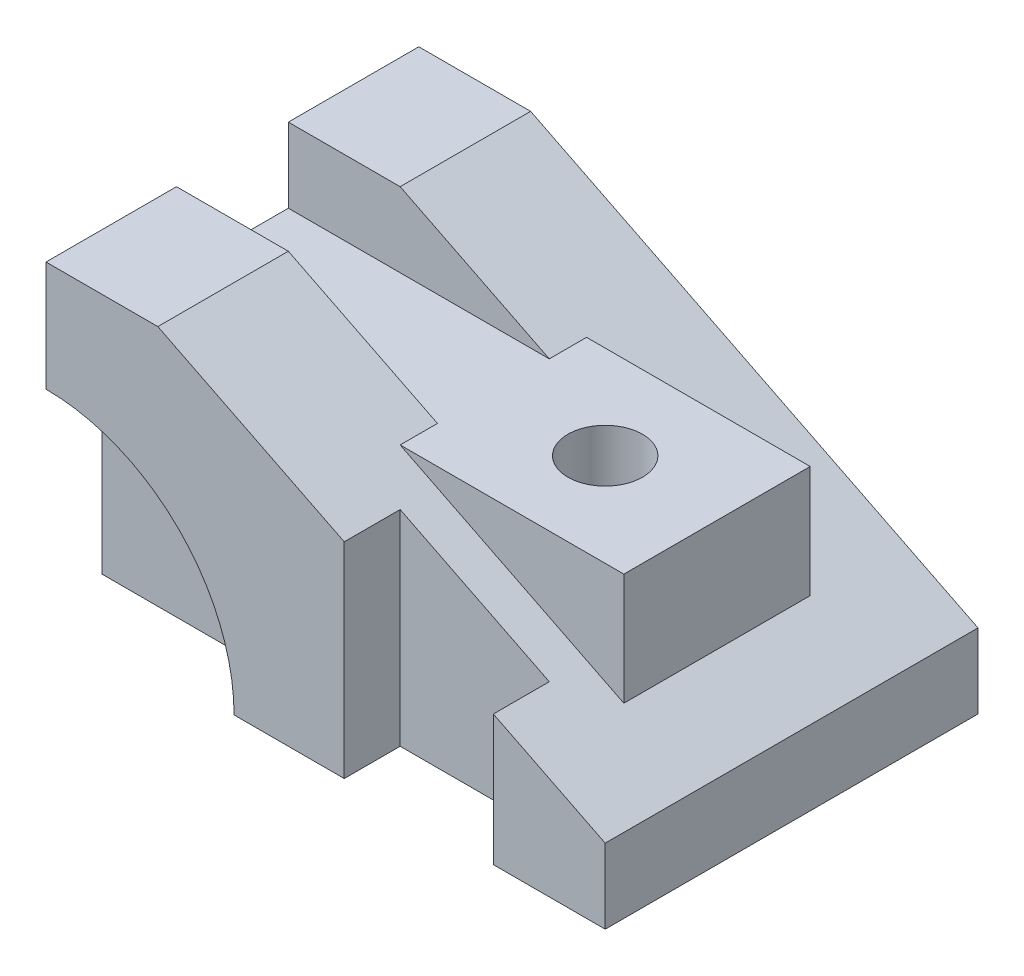
ISO-10303-21;
HEADER;
FILE_DESCRIPTION(('STEP AP214'),'2;1');
FILE_NAME('part.step','',(''),(''),'','','');
FILE_SCHEMA(('AUTOMOTIVE_DESIGN { 1 0 10303 214 1 1 1 1 }'));
ENDSEC;
DATA;
#1=APPLICATION_CONTEXT('core data for automotive mechanical design processes');
#2=APPLICATION_PROTOCOL_DEFINITION('international standard','automotive_design',2000,#1);
#3=PRODUCT_CONTEXT('',#1,'mechanical');
#4=PRODUCT('Part','Part','',(#3));
#5=PRODUCT_RELATED_PRODUCT_CATEGORY('part','',(#4));
#6=PRODUCT_DEFINITION_FORMATION('','',#4);
#7=PRODUCT_DEFINITION_CONTEXT('part definition',#1,'design');
#8=PRODUCT_DEFINITION('design','',#6,#7);
#9=PRODUCT_DEFINITION_SHAPE('','',#8);
#10=(LENGTH_UNIT() NAMED_UNIT(*) SI_UNIT(.MILLI.,.METRE.));
#11=(NAMED_UNIT(*) PLANE_ANGLE_UNIT() SI_UNIT($,.RADIAN.));
#12=(NAMED_UNIT(*) SI_UNIT($,.STERADIAN.) SOLID_ANGLE_UNIT());
#13=UNCERTAINTY_MEASURE_WITH_UNIT(LENGTH_MEASURE(1.E-05),#10,'distance_accuracy_value','');
#14=(GEOMETRIC_REPRESENTATION_CONTEXT(3) GLOBAL_UNCERTAINTY_ASSIGNED_CONTEXT((#13)) GLOBAL_UNIT_ASSIGNED_CONTEXT((#10,
#11,#12)) REPRESENTATION_CONTEXT('',''));
#15=CARTESIAN_POINT('',(0.,0.,0.));
#16=DIRECTION('',(0.,0.,1.));
#17=DIRECTION('',(1.,0.,0.));
#18=AXIS2_PLACEMENT_3D('',#15,#16,#17);
#19=CARTESIAN_POINT('',(0.,0.,50.));
#20=DIRECTION('',(0.,0.,-1.));
#21=DIRECTION('',(-1.,0.,0.));
#22=AXIS2_PLACEMENT_3D('',#19,#20,#21);
#23=PLANE('',#22);
#24=DIRECTION('',(1.,0.,0.));
#25=VECTOR('',#24,1.);
#26=CARTESIAN_POINT('',(150.,0.,50.));
#27=LINE('',#26,#25);
#28=CARTESIAN_POINT('',(50.4505313599585,0.,50.));
#29=VERTEX_POINT('',#28);
#30=CARTESIAN_POINT('',(80.,0.,50.));
#31=VERTEX_POINT('',#30);
#32=EDGE_CURVE('E336',#29,#31,#27,.T.);
#33=ORIENTED_EDGE('',*,*,#32,.T.);
#34=DIRECTION('',(0.,-1.,0.));
#35=VECTOR('',#34,1.);
#36=CARTESIAN_POINT('',(80.,80.001,50.));
#37=LINE('',#36,#35);
#38=CARTESIAN_POINT('',(80.,55.,50.));
#39=VERTEX_POINT('',#38);
#40=EDGE_CURVE('E190',#39,#31,#37,.T.);
#41=ORIENTED_EDGE('',*,*,#40,.F.);
#42=DIRECTION('',(-0.894427190999916,0.447213595499958,0.));
#43=VECTOR('',#42,1.);
#44=CARTESIAN_POINT('',(30.,80.,50.));
#45=LINE('',#44,#43);
#46=CARTESIAN_POINT('',(30.,80.,50.));
#47=VERTEX_POINT('',#46);
#48=EDGE_CURVE('E195',#39,#47,#45,.T.);
#49=ORIENTED_EDGE('',*,*,#48,.T.);
#50=DIRECTION('',(-1.,0.,0.));
#51=VECTOR('',#50,1.);
#52=CARTESIAN_POINT('',(0.,80.,50.));
#53=LINE('',#52,#51);
#54=CARTESIAN_POINT('',(0.,80.,50.));
#55=VERTEX_POINT('',#54);
#56=EDGE_CURVE('E347',#47,#55,#53,.T.);
#57=ORIENTED_EDGE('',*,*,#56,.T.);
#58=DIRECTION('',(0.,-1.,0.));
#59=VECTOR('',#58,1.);
#60=CARTESIAN_POINT('',(0.,0.,50.));
#61=LINE('',#60,#59);
#62=CARTESIAN_POINT('',(0.,50.4505313599585,50.));
#63=VERTEX_POINT('',#62);
#64=EDGE_CURVE('E350',#55,#63,#61,.T.);
#65=ORIENTED_EDGE('',*,*,#64,.T.);
#66=CARTESIAN_POINT('',(0.,0.,50.));
#67=DIRECTION('',(0.,0.,-1.));
#68=DIRECTION('',(-1.,0.,0.));
#69=AXIS2_PLACEMENT_3D('',#66,#67,#68);
#70=CIRCLE('',#69,50.4505313599585);
#71=EDGE_CURVE('E298',#29,#63,#70,.F.);
#72=ORIENTED_EDGE('',*,*,#71,.F.);
#73=EDGE_LOOP('',(#33,#41,#49,#57,#65,#72));
#74=FACE_BOUND('',#73,.T.);
#75=ADVANCED_FACE('F47',(#74),#23,.F.);
#76=CARTESIAN_POINT('',(0.,0.,50.));
#77=DIRECTION('',(1.,0.,0.));
#78=DIRECTION('',(0.,0.,-1.));
#79=AXIS2_PLACEMENT_3D('',#76,#77,#78);
#80=PLANE('',#79);
#81=DIRECTION('',(0.,-1.,0.));
#82=VECTOR('',#81,1.);
#83=CARTESIAN_POINT('',(0.,80.,15.));
#84=LINE('',#83,#82);
#85=CARTESIAN_POINT('',(0.,80.,15.));
#86=VERTEX_POINT('',#85);
#87=CARTESIAN_POINT('',(0.,60.,15.));
#88=VERTEX_POINT('',#87);
#89=EDGE_CURVE('E224',#86,#88,#84,.T.);
#90=ORIENTED_EDGE('',*,*,#89,.T.);
#91=DIRECTION('',(0.,0.,-1.));
#92=VECTOR('',#91,1.);
#93=CARTESIAN_POINT('',(0.,60.,15.));
#94=LINE('',#93,#92);
#95=CARTESIAN_POINT('',(0.,60.,-15.));
#96=VERTEX_POINT('',#95);
#97=EDGE_CURVE('E228',#88,#96,#94,.T.);
#98=ORIENTED_EDGE('',*,*,#97,.T.);
#99=DIRECTION('',(0.,1.,0.));
#100=VECTOR('',#99,1.);
#101=CARTESIAN_POINT('',(0.,80.,-15.));
#102=LINE('',#101,#100);
#103=CARTESIAN_POINT('',(0.,80.,-15.));
#104=VERTEX_POINT('',#103);
#105=EDGE_CURVE('E232',#96,#104,#102,.T.);
#106=ORIENTED_EDGE('',*,*,#105,.T.);
#107=DIRECTION('',(0.,0.,-1.));
#108=VECTOR('',#107,1.);
#109=CARTESIAN_POINT('',(0.,80.,50.));
#110=LINE('',#109,#108);
#111=CARTESIAN_POINT('',(0.,80.,-50.));
#112=VERTEX_POINT('',#111);
#113=EDGE_CURVE('E356',#104,#112,#110,.T.);
#114=ORIENTED_EDGE('',*,*,#113,.T.);
#115=DIRECTION('',(0.,-1.,0.));
#116=VECTOR('',#115,1.);
#117=CARTESIAN_POINT('',(0.,0.,-50.));
#118=LINE('',#117,#116);
#119=CARTESIAN_POINT('',(0.,0.,-50.));
#120=VERTEX_POINT('',#119);
#121=EDGE_CURVE('E331',#112,#120,#118,.T.);
#122=ORIENTED_EDGE('',*,*,#121,.T.);
#123=DIRECTION('',(0.,0.,-1.));
#124=VECTOR('',#123,1.);
#125=CARTESIAN_POINT('',(0.,0.,50.));
#126=LINE('',#125,#124);
#127=CARTESIAN_POINT('',(0.,0.,35.));
#128=VERTEX_POINT('',#127);
#129=EDGE_CURVE('E353',#128,#120,#126,.T.);
#130=ORIENTED_EDGE('',*,*,#129,.F.);
#131=DIRECTION('',(0.,-1.,0.));
#132=VECTOR('',#131,1.);
#133=CARTESIAN_POINT('',(0.,0.,35.));
#134=LINE('',#133,#132);
#135=CARTESIAN_POINT('',(0.,50.4505313599585,35.));
#136=VERTEX_POINT('',#135);
#137=EDGE_CURVE('E302',#136,#128,#134,.T.);
#138=ORIENTED_EDGE('',*,*,#137,.F.);
#139=DIRECTION('',(0.,0.,-1.));
#140=VECTOR('',#139,1.);
#141=CARTESIAN_POINT('',(0.,50.4505313599585,421.53853654145));
#142=LINE('',#141,#140);
#143=EDGE_CURVE('E305',#63,#136,#142,.T.);
#144=ORIENTED_EDGE('',*,*,#143,.F.);
#145=ORIENTED_EDGE('',*,*,#64,.F.);
#146=EDGE_CURVE('E357',#55,#86,#110,.T.);
#147=ORIENTED_EDGE('',*,*,#146,.T.);
#148=EDGE_LOOP('',(#90,#98,#106,#114,#122,#130,#138,#144,#145,#147));
#149=FACE_BOUND('',#148,.T.);
#150=ADVANCED_FACE('F385',(#149),#80,.F.);
#151=CARTESIAN_POINT('',(30.,80.,50.));
#152=DIRECTION('',(-0.447213595499958,-0.894427190999916,0.));
#153=DIRECTION('',(0.894427190999916,-0.447213595499958,0.));
#154=AXIS2_PLACEMENT_3D('',#151,#152,#153);
#155=PLANE('',#154);
#156=ORIENTED_EDGE('',*,*,#48,.F.);
#157=DIRECTION('',(0.,0.,1.));
#158=VECTOR('',#157,1.);
#159=CARTESIAN_POINT('',(80.,55.,50.));
#160=LINE('',#159,#158);
#161=CARTESIAN_POINT('',(80.,55.,35.));
#162=VERTEX_POINT('',#161);
#163=EDGE_CURVE('E173',#162,#39,#160,.T.);
#164=ORIENTED_EDGE('',*,*,#163,.F.);
#165=DIRECTION('',(-0.894427190999916,0.447213595499958,0.));
#166=VECTOR('',#165,1.);
#167=CARTESIAN_POINT('',(69.9996,60.0002,35.));
#168=LINE('',#167,#166);
#169=CARTESIAN_POINT('',(120.,35.,35.));
#170=VERTEX_POINT('',#169);
#171=EDGE_CURVE('E183',#170,#162,#168,.T.);
#172=ORIENTED_EDGE('',*,*,#171,.F.);
#173=DIRECTION('',(0.,0.,-1.));
#174=VECTOR('',#173,1.);
#175=CARTESIAN_POINT('',(120.,35.,50.));
#176=LINE('',#175,#174);
#177=CARTESIAN_POINT('',(120.,35.,50.));
#178=VERTEX_POINT('',#177);
#179=EDGE_CURVE('E197',#178,#170,#176,.T.);
#180=ORIENTED_EDGE('',*,*,#179,.F.);
#181=CARTESIAN_POINT('',(150.,20.,50.));
#182=VERTEX_POINT('',#181);
#183=EDGE_CURVE('E343',#182,#178,#45,.T.);
#184=ORIENTED_EDGE('',*,*,#183,.F.);
#185=DIRECTION('',(0.,0.,-1.));
#186=VECTOR('',#185,1.);
#187=CARTESIAN_POINT('',(150.,20.,50.));
#188=LINE('',#187,#186);
#189=CARTESIAN_POINT('',(150.,20.,-50.));
#190=VERTEX_POINT('',#189);
#191=EDGE_CURVE('E56',#182,#190,#188,.T.);
#192=ORIENTED_EDGE('',*,*,#191,.T.);
#193=DIRECTION('',(-0.894427190999916,0.447213595499958,0.));
#194=VECTOR('',#193,1.);
#195=CARTESIAN_POINT('',(30.,80.,-50.));
#196=LINE('',#195,#194);
#197=CARTESIAN_POINT('',(30.,80.,-50.));
#198=VERTEX_POINT('',#197);
#199=EDGE_CURVE('E323',#190,#198,#196,.T.);
#200=ORIENTED_EDGE('',*,*,#199,.T.);
#201=DIRECTION('',(0.,0.,-1.));
#202=VECTOR('',#201,1.);
#203=CARTESIAN_POINT('',(30.,80.,50.));
#204=LINE('',#203,#202);
#205=CARTESIAN_POINT('',(30.,80.,-15.));
#206=VERTEX_POINT('',#205);
#207=EDGE_CURVE('E361',#206,#198,#204,.T.);
#208=ORIENTED_EDGE('',*,*,#207,.F.);
#209=DIRECTION('',(0.894427190999916,-0.447213595499958,0.));
#210=VECTOR('',#209,1.);
#211=CARTESIAN_POINT('',(126.0008,31.9996,-15.));
#212=LINE('',#211,#210);
#213=CARTESIAN_POINT('',(70.,60.,-15.));
#214=VERTEX_POINT('',#213);
#215=EDGE_CURVE('E189',#206,#214,#212,.T.);
#216=ORIENTED_EDGE('',*,*,#215,.T.);
#217=DIRECTION('',(0.,0.,1.));
#218=VECTOR('',#217,1.);
#219=CARTESIAN_POINT('',(70.,60.,-25.));
#220=LINE('',#219,#218);
#221=CARTESIAN_POINT('',(70.,60.,-25.));
#222=VERTEX_POINT('',#221);
#223=EDGE_CURVE('E281',#222,#214,#220,.T.);
#224=ORIENTED_EDGE('',*,*,#223,.F.);
#225=DIRECTION('',(0.894427190999916,-0.447213595499958,0.));
#226=VECTOR('',#225,1.);
#227=CARTESIAN_POINT('',(130.,30.,-25.));
#228=LINE('',#227,#226);
#229=CARTESIAN_POINT('',(130.,30.,-25.));
#230=VERTEX_POINT('',#229);
#231=EDGE_CURVE('E268',#222,#230,#228,.T.);
#232=ORIENTED_EDGE('',*,*,#231,.T.);
#233=DIRECTION('',(0.,0.,1.));
#234=VECTOR('',#233,1.);
#235=CARTESIAN_POINT('',(130.,30.,-25.));
#236=LINE('',#235,#234);
#237=CARTESIAN_POINT('',(130.,30.,25.));
#238=VERTEX_POINT('',#237);
#239=EDGE_CURVE('E280',#230,#238,#236,.T.);
#240=ORIENTED_EDGE('',*,*,#239,.T.);
#241=DIRECTION('',(0.894427190999916,-0.447213595499958,0.));
#242=VECTOR('',#241,1.);
#243=CARTESIAN_POINT('',(130.,30.,25.));
#244=LINE('',#243,#242);
#245=CARTESIAN_POINT('',(70.,60.,25.));
#246=VERTEX_POINT('',#245);
#247=EDGE_CURVE('E253',#246,#238,#244,.T.);
#248=ORIENTED_EDGE('',*,*,#247,.F.);
#249=CARTESIAN_POINT('',(70.,60.,15.));
#250=VERTEX_POINT('',#249);
#251=EDGE_CURVE('E286',#250,#246,#220,.T.);
#252=ORIENTED_EDGE('',*,*,#251,.F.);
#253=DIRECTION('',(-0.894427190999916,0.447213595499958,0.));
#254=VECTOR('',#253,1.);
#255=CARTESIAN_POINT('',(126.0008,31.9996,15.));
#256=LINE('',#255,#254);
#257=CARTESIAN_POINT('',(30.,80.,15.));
#258=VERTEX_POINT('',#257);
#259=EDGE_CURVE('E220',#250,#258,#256,.T.);
#260=ORIENTED_EDGE('',*,*,#259,.T.);
#261=EDGE_CURVE('E362',#47,#258,#204,.T.);
#262=ORIENTED_EDGE('',*,*,#261,.F.);
#263=EDGE_LOOP('',(#156,#164,#172,#180,#184,#192,#200,#208,#216,#224,#232,#240,#248,#252,#260,#262));
#264=FACE_BOUND('',#263,.T.);
#265=ADVANCED_FACE('F193',(#264),#155,.F.);
#266=CARTESIAN_POINT('',(0.,80.,50.));
#267=DIRECTION('',(0.,-1.,0.));
#268=DIRECTION('',(0.,0.,-1.));
#269=AXIS2_PLACEMENT_3D('',#266,#267,#268);
#270=PLANE('',#269);
#271=DIRECTION('',(-1.,0.,0.));
#272=VECTOR('',#271,1.);
#273=CARTESIAN_POINT('',(150.001,80.,15.));
#274=LINE('',#273,#272);
#275=EDGE_CURVE('E236',#258,#86,#274,.T.);
#276=ORIENTED_EDGE('',*,*,#275,.T.);
#277=ORIENTED_EDGE('',*,*,#146,.F.);
#278=ORIENTED_EDGE('',*,*,#56,.F.);
#279=ORIENTED_EDGE('',*,*,#261,.T.);
#280=EDGE_LOOP('',(#276,#277,#278,#279));
#281=FACE_BOUND('',#280,.T.);
#282=ADVANCED_FACE('F415',(#281),#270,.F.);
#283=DIRECTION('',(-1.,0.,0.));
#284=VECTOR('',#283,1.);
#285=CARTESIAN_POINT('',(150.001,80.,-15.));
#286=LINE('',#285,#284);
#287=EDGE_CURVE('E240',#206,#104,#286,.T.);
#288=ORIENTED_EDGE('',*,*,#287,.F.);
#289=ORIENTED_EDGE('',*,*,#207,.T.);
#290=DIRECTION('',(-1.,0.,0.));
#291=VECTOR('',#290,1.);
#292=CARTESIAN_POINT('',(0.,80.,-50.));
#293=LINE('',#292,#291);
#294=EDGE_CURVE('E327',#198,#112,#293,.T.);
#295=ORIENTED_EDGE('',*,*,#294,.T.);
#296=ORIENTED_EDGE('',*,*,#113,.F.);
#297=EDGE_LOOP('',(#288,#289,#295,#296));
#298=FACE_BOUND('',#297,.T.);
#299=ADVANCED_FACE('F391',(#298),#270,.F.);
#300=ORIENTED_EDGE('',*,*,#183,.T.);
#301=DIRECTION('',(0.,-1.,0.));
#302=VECTOR('',#301,1.);
#303=CARTESIAN_POINT('',(120.,80.001,50.));
#304=LINE('',#303,#302);
#305=CARTESIAN_POINT('',(120.,0.,50.));
#306=VERTEX_POINT('',#305);
#307=EDGE_CURVE('E211',#178,#306,#304,.T.);
#308=ORIENTED_EDGE('',*,*,#307,.T.);
#309=CARTESIAN_POINT('',(150.,0.,50.));
#310=VERTEX_POINT('',#309);
#311=EDGE_CURVE('E335',#306,#310,#27,.T.);
#312=ORIENTED_EDGE('',*,*,#311,.T.);
#313=DIRECTION('',(0.,1.,0.));
#314=VECTOR('',#313,1.);
#315=CARTESIAN_POINT('',(150.,20.,50.));
#316=LINE('',#315,#314);
#317=EDGE_CURVE('E340',#310,#182,#316,.T.);
#318=ORIENTED_EDGE('',*,*,#317,.T.);
#319=EDGE_LOOP('',(#300,#308,#312,#318));
#320=FACE_BOUND('',#319,.T.);
#321=ADVANCED_FACE('F424',(#320),#23,.F.);
#322=CARTESIAN_POINT('',(150.,0.,50.));
#323=DIRECTION('',(0.,1.,0.));
#324=DIRECTION('',(-1.,0.,0.));
#325=AXIS2_PLACEMENT_3D('',#322,#323,#324);
#326=PLANE('',#325);
#327=CARTESIAN_POINT('',(100.,0.,0.));
#328=DIRECTION('',(0.,1.,0.));
#329=DIRECTION('',(0.,0.,1.));
#330=AXIS2_PLACEMENT_3D('',#327,#328,#329);
#331=CIRCLE('',#330,9.99999999999999);
#332=CARTESIAN_POINT('',(100.,0.,9.99999999999999));
#333=VERTEX_POINT('',#332);
#334=EDGE_CURVE('E249',#333,#333,#331,.T.);
#335=ORIENTED_EDGE('',*,*,#334,.T.);
#336=EDGE_LOOP('',(#335));
#337=FACE_BOUND('',#336,.T.);
#338=DIRECTION('',(1.,0.,0.));
#339=VECTOR('',#338,1.);
#340=CARTESIAN_POINT('',(80.,0.,35.));
#341=LINE('',#340,#339);
#342=CARTESIAN_POINT('',(80.,0.,35.));
#343=VERTEX_POINT('',#342);
#344=CARTESIAN_POINT('',(120.,0.,35.));
#345=VERTEX_POINT('',#344);
#346=EDGE_CURVE('E201',#343,#345,#341,.T.);
#347=ORIENTED_EDGE('',*,*,#346,.F.);
#348=DIRECTION('',(0.,0.,-1.));
#349=VECTOR('',#348,1.);
#350=CARTESIAN_POINT('',(80.,0.,50.));
#351=LINE('',#350,#349);
#352=EDGE_CURVE('E63',#31,#343,#351,.T.);
#353=ORIENTED_EDGE('',*,*,#352,.F.);
#354=ORIENTED_EDGE('',*,*,#32,.F.);
#355=DIRECTION('',(0.,0.,-1.));
#356=VECTOR('',#355,1.);
#357=CARTESIAN_POINT('',(50.4505313599585,0.,421.53853654145));
#358=LINE('',#357,#356);
#359=CARTESIAN_POINT('',(50.4505313599585,0.,35.));
#360=VERTEX_POINT('',#359);
#361=EDGE_CURVE('E297',#29,#360,#358,.T.);
#362=ORIENTED_EDGE('',*,*,#361,.T.);
#363=DIRECTION('',(1.,0.,0.));
#364=VECTOR('',#363,1.);
#365=CARTESIAN_POINT('',(150.,0.,35.));
#366=LINE('',#365,#364);
#367=EDGE_CURVE('E285',#128,#360,#366,.T.);
#368=ORIENTED_EDGE('',*,*,#367,.F.);
#369=ORIENTED_EDGE('',*,*,#129,.T.);
#370=DIRECTION('',(1.,0.,0.));
#371=VECTOR('',#370,1.);
#372=CARTESIAN_POINT('',(150.,0.,-50.));
#373=LINE('',#372,#371);
#374=CARTESIAN_POINT('',(150.,0.,-50.));
#375=VERTEX_POINT('',#374);
#376=EDGE_CURVE('E309',#120,#375,#373,.T.);
#377=ORIENTED_EDGE('',*,*,#376,.T.);
#378=DIRECTION('',(0.,0.,-1.));
#379=VECTOR('',#378,1.);
#380=CARTESIAN_POINT('',(150.,0.,50.));
#381=LINE('',#380,#379);
#382=EDGE_CURVE('E11',#310,#375,#381,.T.);
#383=ORIENTED_EDGE('',*,*,#382,.F.);
#384=ORIENTED_EDGE('',*,*,#311,.F.);
#385=DIRECTION('',(0.,0.,1.));
#386=VECTOR('',#385,1.);
#387=CARTESIAN_POINT('',(120.,0.,50.));
#388=LINE('',#387,#386);
#389=EDGE_CURVE('E180',#345,#306,#388,.T.);
#390=ORIENTED_EDGE('',*,*,#389,.F.);
#391=EDGE_LOOP('',(#347,#353,#354,#362,#368,#369,#377,#383,#384,#390));
#392=FACE_BOUND('',#391,.T.);
#393=ADVANCED_FACE('F49',(#337,#392),#326,.F.);
#394=CARTESIAN_POINT('',(150.,20.,50.));
#395=DIRECTION('',(-1.,0.,0.));
#396=DIRECTION('',(0.,0.,1.));
#397=AXIS2_PLACEMENT_3D('',#394,#395,#396);
#398=PLANE('',#397);
#399=ORIENTED_EDGE('',*,*,#382,.T.);
#400=DIRECTION('',(0.,1.,0.));
#401=VECTOR('',#400,1.);
#402=CARTESIAN_POINT('',(150.,20.,-50.));
#403=LINE('',#402,#401);
#404=EDGE_CURVE('E319',#375,#190,#403,.T.);
#405=ORIENTED_EDGE('',*,*,#404,.T.);
#406=ORIENTED_EDGE('',*,*,#191,.F.);
#407=ORIENTED_EDGE('',*,*,#317,.F.);
#408=EDGE_LOOP('',(#399,#405,#406,#407));
#409=FACE_BOUND('',#408,.T.);
#410=ADVANCED_FACE('F378',(#409),#398,.F.);
#411=CARTESIAN_POINT('',(0.,0.,-50.));
#412=DIRECTION('',(0.,0.,-1.));
#413=DIRECTION('',(-1.,0.,0.));
#414=AXIS2_PLACEMENT_3D('',#411,#412,#413);
#415=PLANE('',#414);
#416=ORIENTED_EDGE('',*,*,#376,.F.);
#417=ORIENTED_EDGE('',*,*,#121,.F.);
#418=ORIENTED_EDGE('',*,*,#294,.F.);
#419=ORIENTED_EDGE('',*,*,#199,.F.);
#420=ORIENTED_EDGE('',*,*,#404,.F.);
#421=EDGE_LOOP('',(#416,#417,#418,#419,#420));
#422=FACE_BOUND('',#421,.T.);
#423=ADVANCED_FACE('F376',(#422),#415,.T.);
#424=CARTESIAN_POINT('',(0.,0.,421.53853654145));
#425=DIRECTION('',(0.,0.,-1.));
#426=DIRECTION('',(-1.,0.,0.));
#427=AXIS2_PLACEMENT_3D('',#424,#425,#426);
#428=CYLINDRICAL_SURFACE('',#427,50.4505313599585);
#429=ORIENTED_EDGE('',*,*,#71,.T.);
#430=ORIENTED_EDGE('',*,*,#143,.T.);
#431=CARTESIAN_POINT('',(0.,0.,35.));
#432=DIRECTION('',(0.,0.,-1.));
#433=DIRECTION('',(-1.,0.,0.));
#434=AXIS2_PLACEMENT_3D('',#431,#432,#433);
#435=CIRCLE('',#434,50.4505313599585);
#436=EDGE_CURVE('E293',#360,#136,#435,.F.);
#437=ORIENTED_EDGE('',*,*,#436,.F.);
#438=ORIENTED_EDGE('',*,*,#361,.F.);
#439=EDGE_LOOP('',(#429,#430,#437,#438));
#440=FACE_BOUND('',#439,.T.);
#441=ADVANCED_FACE('F450',(#440),#428,.F.);
#442=CARTESIAN_POINT('',(0.,0.,35.));
#443=DIRECTION('',(0.,0.,-1.));
#444=DIRECTION('',(-1.,0.,0.));
#445=AXIS2_PLACEMENT_3D('',#442,#443,#444);
#446=PLANE('',#445);
#447=ORIENTED_EDGE('',*,*,#436,.T.);
#448=ORIENTED_EDGE('',*,*,#137,.T.);
#449=ORIENTED_EDGE('',*,*,#367,.T.);
#450=EDGE_LOOP('',(#447,#448,#449));
#451=FACE_BOUND('',#450,.T.);
#452=ADVANCED_FACE('F454',(#451),#446,.F.);
#453=CARTESIAN_POINT('',(70.,60.,-25.));
#454=DIRECTION('',(0.,1.,0.));
#455=DIRECTION('',(0.,0.,1.));
#456=AXIS2_PLACEMENT_3D('',#453,#454,#455);
#457=PLANE('',#456);
#458=CARTESIAN_POINT('',(100.,60.,0.));
#459=DIRECTION('',(0.,1.,0.));
#460=DIRECTION('',(0.,0.,1.));
#461=AXIS2_PLACEMENT_3D('',#458,#459,#460);
#462=CIRCLE('',#461,9.99999999999999);
#463=CARTESIAN_POINT('',(100.,60.,9.99999999999999));
#464=VERTEX_POINT('',#463);
#465=EDGE_CURVE('E248',#464,#464,#462,.T.);
#466=ORIENTED_EDGE('',*,*,#465,.F.);
#467=EDGE_LOOP('',(#466));
#468=FACE_BOUND('',#467,.T.);
#469=ORIENTED_EDGE('',*,*,#223,.T.);
#470=DIRECTION('',(-1.,0.,0.));
#471=VECTOR('',#470,1.);
#472=CARTESIAN_POINT('',(150.001,60.,-15.));
#473=LINE('',#472,#471);
#474=EDGE_CURVE('E243',#214,#96,#473,.T.);
#475=ORIENTED_EDGE('',*,*,#474,.T.);
#476=ORIENTED_EDGE('',*,*,#97,.F.);
#477=DIRECTION('',(-1.,0.,0.));
#478=VECTOR('',#477,1.);
#479=CARTESIAN_POINT('',(150.001,60.,15.));
#480=LINE('',#479,#478);
#481=EDGE_CURVE('E71',#250,#88,#480,.T.);
#482=ORIENTED_EDGE('',*,*,#481,.F.);
#483=ORIENTED_EDGE('',*,*,#251,.T.);
#484=DIRECTION('',(-1.,0.,0.));
#485=VECTOR('',#484,1.);
#486=CARTESIAN_POINT('',(70.,60.,25.));
#487=LINE('',#486,#485);
#488=CARTESIAN_POINT('',(130.,60.,25.));
#489=VERTEX_POINT('',#488);
#490=EDGE_CURVE('E264',#489,#246,#487,.T.);
#491=ORIENTED_EDGE('',*,*,#490,.F.);
#492=DIRECTION('',(0.,0.,1.));
#493=VECTOR('',#492,1.);
#494=CARTESIAN_POINT('',(130.,60.,-25.));
#495=LINE('',#494,#493);
#496=CARTESIAN_POINT('',(130.,60.,-25.));
#497=VERTEX_POINT('',#496);
#498=EDGE_CURVE('E287',#497,#489,#495,.T.);
#499=ORIENTED_EDGE('',*,*,#498,.F.);
#500=DIRECTION('',(-1.,0.,0.));
#501=VECTOR('',#500,1.);
#502=CARTESIAN_POINT('',(70.,60.,-25.));
#503=LINE('',#502,#501);
#504=EDGE_CURVE('E276',#497,#222,#503,.T.);
#505=ORIENTED_EDGE('',*,*,#504,.T.);
#506=EDGE_LOOP('',(#469,#475,#476,#482,#483,#491,#499,#505));
#507=FACE_BOUND('',#506,.T.);
#508=ADVANCED_FACE('F398',(#468,#507),#457,.T.);
#509=CARTESIAN_POINT('',(130.,60.,-25.));
#510=DIRECTION('',(1.,0.,0.));
#511=DIRECTION('',(0.,0.,-1.));
#512=AXIS2_PLACEMENT_3D('',#509,#510,#511);
#513=PLANE('',#512);
#514=ORIENTED_EDGE('',*,*,#498,.T.);
#515=DIRECTION('',(0.,1.,0.));
#516=VECTOR('',#515,1.);
#517=CARTESIAN_POINT('',(130.,60.,25.));
#518=LINE('',#517,#516);
#519=EDGE_CURVE('E260',#238,#489,#518,.T.);
#520=ORIENTED_EDGE('',*,*,#519,.F.);
#521=ORIENTED_EDGE('',*,*,#239,.F.);
#522=DIRECTION('',(0.,1.,0.));
#523=VECTOR('',#522,1.);
#524=CARTESIAN_POINT('',(130.,60.,-25.));
#525=LINE('',#524,#523);
#526=EDGE_CURVE('E272',#230,#497,#525,.T.);
#527=ORIENTED_EDGE('',*,*,#526,.T.);
#528=EDGE_LOOP('',(#514,#520,#521,#527));
#529=FACE_BOUND('',#528,.T.);
#530=ADVANCED_FACE('F405',(#529),#513,.T.);
#531=CARTESIAN_POINT('',(0.,0.,-25.));
#532=DIRECTION('',(0.,0.,1.));
#533=DIRECTION('',(1.,0.,0.));
#534=AXIS2_PLACEMENT_3D('',#531,#532,#533);
#535=PLANE('',#534);
#536=ORIENTED_EDGE('',*,*,#231,.F.);
#537=ORIENTED_EDGE('',*,*,#504,.F.);
#538=ORIENTED_EDGE('',*,*,#526,.F.);
#539=EDGE_LOOP('',(#536,#537,#538));
#540=FACE_BOUND('',#539,.T.);
#541=ADVANCED_FACE('F463',(#540),#535,.F.);
#542=CARTESIAN_POINT('',(0.,0.,25.));
#543=DIRECTION('',(0.,0.,1.));
#544=DIRECTION('',(1.,0.,0.));
#545=AXIS2_PLACEMENT_3D('',#542,#543,#544);
#546=PLANE('',#545);
#547=ORIENTED_EDGE('',*,*,#247,.T.);
#548=ORIENTED_EDGE('',*,*,#519,.T.);
#549=ORIENTED_EDGE('',*,*,#490,.T.);
#550=EDGE_LOOP('',(#547,#548,#549));
#551=FACE_BOUND('',#550,.T.);
#552=ADVANCED_FACE('F401',(#551),#546,.T.);
#553=CARTESIAN_POINT('',(100.,0.,0.));
#554=DIRECTION('',(0.,1.,0.));
#555=DIRECTION('',(0.,0.,1.));
#556=AXIS2_PLACEMENT_3D('',#553,#554,#555);
#557=CYLINDRICAL_SURFACE('',#556,9.99999999999999);
#558=ORIENTED_EDGE('',*,*,#334,.F.);
#559=EDGE_LOOP('',(#558));
#560=FACE_BOUND('',#559,.T.);
#561=ORIENTED_EDGE('',*,*,#465,.T.);
#562=EDGE_LOOP('',(#561));
#563=FACE_BOUND('',#562,.T.);
#564=ADVANCED_FACE('F471',(#560,#563),#557,.F.);
#565=CARTESIAN_POINT('',(150.001,80.,15.));
#566=DIRECTION('',(0.,0.,-1.));
#567=DIRECTION('',(0.,1.,0.));
#568=AXIS2_PLACEMENT_3D('',#565,#566,#567);
#569=PLANE('',#568);
#570=ORIENTED_EDGE('',*,*,#481,.T.);
#571=ORIENTED_EDGE('',*,*,#89,.F.);
#572=ORIENTED_EDGE('',*,*,#275,.F.);
#573=ORIENTED_EDGE('',*,*,#259,.F.);
#574=EDGE_LOOP('',(#570,#571,#572,#573));
#575=FACE_BOUND('',#574,.T.);
#576=ADVANCED_FACE('F413',(#575),#569,.T.);
#577=CARTESIAN_POINT('',(150.001,80.,-15.));
#578=DIRECTION('',(0.,0.,1.));
#579=DIRECTION('',(0.,-1.,0.));
#580=AXIS2_PLACEMENT_3D('',#577,#578,#579);
#581=PLANE('',#580);
#582=ORIENTED_EDGE('',*,*,#287,.T.);
#583=ORIENTED_EDGE('',*,*,#105,.F.);
#584=ORIENTED_EDGE('',*,*,#474,.F.);
#585=ORIENTED_EDGE('',*,*,#215,.F.);
#586=EDGE_LOOP('',(#582,#583,#584,#585));
#587=FACE_BOUND('',#586,.T.);
#588=ADVANCED_FACE('F409',(#587),#581,.T.);
#589=CARTESIAN_POINT('',(80.,80.001,50.));
#590=DIRECTION('',(-1.,0.,0.));
#591=DIRECTION('',(0.,0.,1.));
#592=AXIS2_PLACEMENT_3D('',#589,#590,#591);
#593=PLANE('',#592);
#594=ORIENTED_EDGE('',*,*,#163,.T.);
#595=ORIENTED_EDGE('',*,*,#40,.T.);
#596=ORIENTED_EDGE('',*,*,#352,.T.);
#597=DIRECTION('',(0.,-1.,0.));
#598=VECTOR('',#597,1.);
#599=CARTESIAN_POINT('',(80.,80.001,35.));
#600=LINE('',#599,#598);
#601=EDGE_CURVE('E169',#162,#343,#600,.T.);
#602=ORIENTED_EDGE('',*,*,#601,.F.);
#603=EDGE_LOOP('',(#594,#595,#596,#602));
#604=FACE_BOUND('',#603,.T.);
#605=ADVANCED_FACE('F171',(#604),#593,.F.);
#606=CARTESIAN_POINT('',(120.,80.001,50.));
#607=DIRECTION('',(1.,0.,0.));
#608=DIRECTION('',(0.,1.,0.));
#609=AXIS2_PLACEMENT_3D('',#606,#607,#608);
#610=PLANE('',#609);
#611=ORIENTED_EDGE('',*,*,#179,.T.);
#612=DIRECTION('',(0.,-1.,0.));
#613=VECTOR('',#612,1.);
#614=CARTESIAN_POINT('',(120.,80.001,35.));
#615=LINE('',#614,#613);
#616=EDGE_CURVE('E179',#170,#345,#615,.T.);
#617=ORIENTED_EDGE('',*,*,#616,.T.);
#618=ORIENTED_EDGE('',*,*,#389,.T.);
#619=ORIENTED_EDGE('',*,*,#307,.F.);
#620=EDGE_LOOP('',(#611,#617,#618,#619));
#621=FACE_BOUND('',#620,.T.);
#622=ADVANCED_FACE('F422',(#621),#610,.F.);
#623=CARTESIAN_POINT('',(80.,80.001,35.));
#624=DIRECTION('',(0.,0.,-1.));
#625=DIRECTION('',(-1.,0.,0.));
#626=AXIS2_PLACEMENT_3D('',#623,#624,#625);
#627=PLANE('',#626);
#628=ORIENTED_EDGE('',*,*,#171,.T.);
#629=ORIENTED_EDGE('',*,*,#601,.T.);
#630=ORIENTED_EDGE('',*,*,#346,.T.);
#631=ORIENTED_EDGE('',*,*,#616,.F.);
#632=EDGE_LOOP('',(#628,#629,#630,#631));
#633=FACE_BOUND('',#632,.T.);
#634=ADVANCED_FACE('F184',(#633),#627,.F.);
#635=CLOSED_SHELL('',(#75,#150,#265,#282,#299,#321,#393,#410,#423,#441,#452,#508,#530,#541,#552,
#564,#576,#588,#605,#622,#634));
#636=MANIFOLD_SOLID_BREP('B2',#635);
#637=ADVANCED_BREP_SHAPE_REPRESENTATION('',(#18,#636),#14);
#638=SHAPE_DEFINITION_REPRESENTATION(#9,#637);
ENDSEC;
END-ISO-10303-21;
